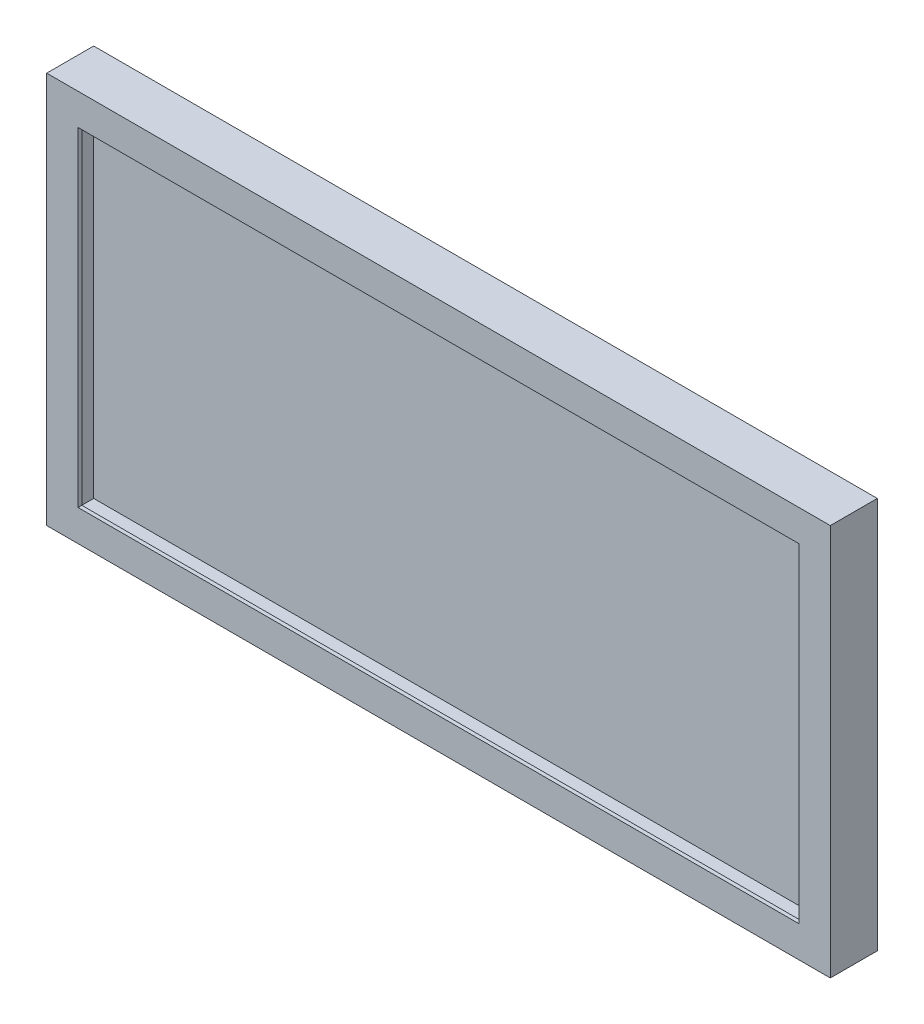
ISO-10303-21;
HEADER;
FILE_DESCRIPTION(('STEP AP214'),'2;1');
FILE_NAME('part.step','',(''),(''),'','','');
FILE_SCHEMA(('AUTOMOTIVE_DESIGN { 1 0 10303 214 1 1 1 1 }'));
ENDSEC;
DATA;
#1=APPLICATION_CONTEXT('core data for automotive mechanical design processes');
#2=APPLICATION_PROTOCOL_DEFINITION('international standard','automotive_design',2000,#1);
#3=PRODUCT_CONTEXT('',#1,'mechanical');
#4=PRODUCT('Part','Part','',(#3));
#5=PRODUCT_RELATED_PRODUCT_CATEGORY('part','',(#4));
#6=PRODUCT_DEFINITION_FORMATION('','',#4);
#7=PRODUCT_DEFINITION_CONTEXT('part definition',#1,'design');
#8=PRODUCT_DEFINITION('design','',#6,#7);
#9=PRODUCT_DEFINITION_SHAPE('','',#8);
#10=(LENGTH_UNIT() NAMED_UNIT(*) SI_UNIT(.MILLI.,.METRE.));
#11=(NAMED_UNIT(*) PLANE_ANGLE_UNIT() SI_UNIT($,.RADIAN.));
#12=(NAMED_UNIT(*) SI_UNIT($,.STERADIAN.) SOLID_ANGLE_UNIT());
#13=UNCERTAINTY_MEASURE_WITH_UNIT(LENGTH_MEASURE(1.E-05),#10,'distance_accuracy_value','');
#14=(GEOMETRIC_REPRESENTATION_CONTEXT(3) GLOBAL_UNCERTAINTY_ASSIGNED_CONTEXT((#13)) GLOBAL_UNIT_ASSIGNED_CONTEXT((#10,
#11,#12)) REPRESENTATION_CONTEXT('',''));
#15=CARTESIAN_POINT('',(0.,0.,0.));
#16=DIRECTION('',(0.,0.,1.));
#17=DIRECTION('',(1.,0.,0.));
#18=AXIS2_PLACEMENT_3D('',#15,#16,#17);
#19=CARTESIAN_POINT('',(-125.,-61.3,15.));
#20=DIRECTION('',(0.,1.,0.));
#21=DIRECTION('',(-1.,0.,0.));
#22=AXIS2_PLACEMENT_3D('',#19,#20,#21);
#23=PLANE('',#22);
#24=DIRECTION('',(1.,0.,0.));
#25=VECTOR('',#24,1.);
#26=CARTESIAN_POINT('',(-125.,-61.3,1.2));
#27=LINE('',#26,#25);
#28=CARTESIAN_POINT('',(-123.8,-61.3,1.2));
#29=VERTEX_POINT('',#28);
#30=CARTESIAN_POINT('',(123.8,-61.3,1.2));
#31=VERTEX_POINT('',#30);
#32=EDGE_CURVE('E38',#29,#31,#27,.T.);
#33=ORIENTED_EDGE('',*,*,#32,.F.);
#34=DIRECTION('',(0.,0.,-1.));
#35=VECTOR('',#34,1.);
#36=CARTESIAN_POINT('',(-123.8,-61.3,15.));
#37=LINE('',#36,#35);
#38=CARTESIAN_POINT('',(-123.8,-61.3,13.8));
#39=VERTEX_POINT('',#38);
#40=EDGE_CURVE('E202',#39,#29,#37,.T.);
#41=ORIENTED_EDGE('',*,*,#40,.F.);
#42=DIRECTION('',(1.,0.,0.));
#43=VECTOR('',#42,1.);
#44=CARTESIAN_POINT('',(-125.,-61.3,13.8));
#45=LINE('',#44,#43);
#46=CARTESIAN_POINT('',(123.8,-61.3,13.8));
#47=VERTEX_POINT('',#46);
#48=EDGE_CURVE('E185',#39,#47,#45,.T.);
#49=ORIENTED_EDGE('',*,*,#48,.T.);
#50=DIRECTION('',(0.,0.,-1.));
#51=VECTOR('',#50,1.);
#52=CARTESIAN_POINT('',(123.8,-61.3,15.));
#53=LINE('',#52,#51);
#54=EDGE_CURVE('E198',#47,#31,#53,.T.);
#55=ORIENTED_EDGE('',*,*,#54,.T.);
#56=EDGE_LOOP('',(#33,#41,#49,#55));
#57=FACE_BOUND('',#56,.T.);
#58=ADVANCED_FACE('F34',(#57),#23,.T.);
#59=CARTESIAN_POINT('',(123.8,-62.5,15.));
#60=DIRECTION('',(-1.,0.,0.));
#61=DIRECTION('',(0.,0.,1.));
#62=AXIS2_PLACEMENT_3D('',#59,#60,#61);
#63=PLANE('',#62);
#64=DIRECTION('',(0.,1.,0.));
#65=VECTOR('',#64,1.);
#66=CARTESIAN_POINT('',(123.8,-62.5,1.2));
#67=LINE('',#66,#65);
#68=CARTESIAN_POINT('',(123.8,61.3,1.2));
#69=VERTEX_POINT('',#68);
#70=EDGE_CURVE('E201',#31,#69,#67,.T.);
#71=ORIENTED_EDGE('',*,*,#70,.F.);
#72=ORIENTED_EDGE('',*,*,#54,.F.);
#73=DIRECTION('',(0.,1.,0.));
#74=VECTOR('',#73,1.);
#75=CARTESIAN_POINT('',(123.8,-62.5,13.8));
#76=LINE('',#75,#74);
#77=CARTESIAN_POINT('',(123.8,61.3,13.8));
#78=VERTEX_POINT('',#77);
#79=EDGE_CURVE('E183',#47,#78,#76,.T.);
#80=ORIENTED_EDGE('',*,*,#79,.T.);
#81=DIRECTION('',(0.,0.,-1.));
#82=VECTOR('',#81,1.);
#83=CARTESIAN_POINT('',(123.8,61.3,15.));
#84=LINE('',#83,#82);
#85=EDGE_CURVE('E193',#78,#69,#84,.T.);
#86=ORIENTED_EDGE('',*,*,#85,.T.);
#87=EDGE_LOOP('',(#71,#72,#80,#86));
#88=FACE_BOUND('',#87,.T.);
#89=ADVANCED_FACE('F214',(#88),#63,.T.);
#90=CARTESIAN_POINT('',(-125.,61.3,15.));
#91=DIRECTION('',(0.,-1.,0.));
#92=DIRECTION('',(0.,0.,-1.));
#93=AXIS2_PLACEMENT_3D('',#90,#91,#92);
#94=PLANE('',#93);
#95=DIRECTION('',(-1.,0.,0.));
#96=VECTOR('',#95,1.);
#97=CARTESIAN_POINT('',(-125.,61.3,1.2));
#98=LINE('',#97,#96);
#99=CARTESIAN_POINT('',(-123.8,61.3,1.2));
#100=VERTEX_POINT('',#99);
#101=EDGE_CURVE('E196',#69,#100,#98,.T.);
#102=ORIENTED_EDGE('',*,*,#101,.F.);
#103=ORIENTED_EDGE('',*,*,#85,.F.);
#104=DIRECTION('',(-1.,0.,0.));
#105=VECTOR('',#104,1.);
#106=CARTESIAN_POINT('',(-125.,61.3,13.8));
#107=LINE('',#106,#105);
#108=CARTESIAN_POINT('',(-123.8,61.3,13.8));
#109=VERTEX_POINT('',#108);
#110=EDGE_CURVE('E43',#78,#109,#107,.T.);
#111=ORIENTED_EDGE('',*,*,#110,.T.);
#112=DIRECTION('',(0.,0.,-1.));
#113=VECTOR('',#112,1.);
#114=CARTESIAN_POINT('',(-123.8,61.3,15.));
#115=LINE('',#114,#113);
#116=EDGE_CURVE('E188',#109,#100,#115,.T.);
#117=ORIENTED_EDGE('',*,*,#116,.T.);
#118=EDGE_LOOP('',(#102,#103,#111,#117));
#119=FACE_BOUND('',#118,.T.);
#120=ADVANCED_FACE('F219',(#119),#94,.T.);
#121=CARTESIAN_POINT('',(-123.8,-62.5,15.));
#122=DIRECTION('',(1.,0.,0.));
#123=DIRECTION('',(0.,0.,-1.));
#124=AXIS2_PLACEMENT_3D('',#121,#122,#123);
#125=PLANE('',#124);
#126=DIRECTION('',(0.,-1.,0.));
#127=VECTOR('',#126,1.);
#128=CARTESIAN_POINT('',(-123.8,-62.5,1.2));
#129=LINE('',#128,#127);
#130=EDGE_CURVE('E191',#100,#29,#129,.T.);
#131=ORIENTED_EDGE('',*,*,#130,.F.);
#132=ORIENTED_EDGE('',*,*,#116,.F.);
#133=DIRECTION('',(0.,-1.,0.));
#134=VECTOR('',#133,1.);
#135=CARTESIAN_POINT('',(-123.8,-62.5,13.8));
#136=LINE('',#135,#134);
#137=EDGE_CURVE('E11',#109,#39,#136,.T.);
#138=ORIENTED_EDGE('',*,*,#137,.T.);
#139=ORIENTED_EDGE('',*,*,#40,.T.);
#140=EDGE_LOOP('',(#131,#132,#138,#139));
#141=FACE_BOUND('',#140,.T.);
#142=ADVANCED_FACE('F222',(#141),#125,.T.);
#143=CARTESIAN_POINT('',(0.,0.,13.8));
#144=DIRECTION('',(0.,0.,1.));
#145=DIRECTION('',(1.,0.,0.));
#146=AXIS2_PLACEMENT_3D('',#143,#144,#145);
#147=PLANE('',#146);
#148=DIRECTION('',(0.,1.,0.));
#149=VECTOR('',#148,1.);
#150=CARTESIAN_POINT('',(-115.,52.5,13.8));
#151=LINE('',#150,#149);
#152=CARTESIAN_POINT('',(-115.,-52.5,13.8));
#153=VERTEX_POINT('',#152);
#154=CARTESIAN_POINT('',(-115.,52.5,13.8));
#155=VERTEX_POINT('',#154);
#156=EDGE_CURVE('E128',#153,#155,#151,.T.);
#157=ORIENTED_EDGE('',*,*,#156,.F.);
#158=DIRECTION('',(-1.,0.,0.));
#159=VECTOR('',#158,1.);
#160=CARTESIAN_POINT('',(-115.,-52.5,13.8));
#161=LINE('',#160,#159);
#162=CARTESIAN_POINT('',(115.,-52.5,13.8));
#163=VERTEX_POINT('',#162);
#164=EDGE_CURVE('E135',#163,#153,#161,.T.);
#165=ORIENTED_EDGE('',*,*,#164,.F.);
#166=DIRECTION('',(0.,-1.,0.));
#167=VECTOR('',#166,1.);
#168=CARTESIAN_POINT('',(115.,-52.5,13.8));
#169=LINE('',#168,#167);
#170=CARTESIAN_POINT('',(115.,52.5,13.8));
#171=VERTEX_POINT('',#170);
#172=EDGE_CURVE('E140',#171,#163,#169,.T.);
#173=ORIENTED_EDGE('',*,*,#172,.F.);
#174=DIRECTION('',(1.,0.,0.));
#175=VECTOR('',#174,1.);
#176=CARTESIAN_POINT('',(115.,52.5,13.8));
#177=LINE('',#176,#175);
#178=EDGE_CURVE('E59',#155,#171,#177,.T.);
#179=ORIENTED_EDGE('',*,*,#178,.F.);
#180=EDGE_LOOP('',(#157,#165,#173,#179));
#181=FACE_BOUND('',#180,.T.);
#182=ORIENTED_EDGE('',*,*,#48,.F.);
#183=ORIENTED_EDGE('',*,*,#137,.F.);
#184=ORIENTED_EDGE('',*,*,#110,.F.);
#185=ORIENTED_EDGE('',*,*,#79,.F.);
#186=EDGE_LOOP('',(#182,#183,#184,#185));
#187=FACE_BOUND('',#186,.T.);
#188=ADVANCED_FACE('F142',(#181,#187),#147,.F.);
#189=CARTESIAN_POINT('',(0.,0.,1.2));
#190=DIRECTION('',(0.,0.,1.));
#191=DIRECTION('',(1.,0.,0.));
#192=AXIS2_PLACEMENT_3D('',#189,#190,#191);
#193=PLANE('',#192);
#194=ORIENTED_EDGE('',*,*,#32,.T.);
#195=ORIENTED_EDGE('',*,*,#70,.T.);
#196=ORIENTED_EDGE('',*,*,#101,.T.);
#197=ORIENTED_EDGE('',*,*,#130,.T.);
#198=EDGE_LOOP('',(#194,#195,#196,#197));
#199=FACE_BOUND('',#198,.T.);
#200=ADVANCED_FACE('F36',(#199),#193,.T.);
#201=CARTESIAN_POINT('',(-115.,-52.5,-0.000999999999999265));
#202=DIRECTION('',(0.,-1.,0.));
#203=DIRECTION('',(1.,0.,0.));
#204=AXIS2_PLACEMENT_3D('',#201,#202,#203);
#205=PLANE('',#204);
#206=ORIENTED_EDGE('',*,*,#164,.T.);
#207=DIRECTION('',(0.,0.,1.));
#208=VECTOR('',#207,1.);
#209=CARTESIAN_POINT('',(-115.,-52.5,-0.000999999999999265));
#210=LINE('',#209,#208);
#211=CARTESIAN_POINT('',(-115.,-52.5,15.));
#212=VERTEX_POINT('',#211);
#213=EDGE_CURVE('E124',#153,#212,#210,.T.);
#214=ORIENTED_EDGE('',*,*,#213,.T.);
#215=DIRECTION('',(1.,0.,0.));
#216=VECTOR('',#215,1.);
#217=CARTESIAN_POINT('',(-115.,-52.5,15.));
#218=LINE('',#217,#216);
#219=CARTESIAN_POINT('',(115.,-52.5,15.));
#220=VERTEX_POINT('',#219);
#221=EDGE_CURVE('E51',#212,#220,#218,.T.);
#222=ORIENTED_EDGE('',*,*,#221,.T.);
#223=DIRECTION('',(0.,0.,1.));
#224=VECTOR('',#223,1.);
#225=CARTESIAN_POINT('',(115.,-52.5,-0.000999999999999265));
#226=LINE('',#225,#224);
#227=EDGE_CURVE('E132',#163,#220,#226,.T.);
#228=ORIENTED_EDGE('',*,*,#227,.F.);
#229=EDGE_LOOP('',(#206,#214,#222,#228));
#230=FACE_BOUND('',#229,.T.);
#231=ADVANCED_FACE('F136',(#230),#205,.F.);
#232=CARTESIAN_POINT('',(-115.,52.5,-0.000999999999999265));
#233=DIRECTION('',(-1.,0.,0.));
#234=DIRECTION('',(0.,0.,1.));
#235=AXIS2_PLACEMENT_3D('',#232,#233,#234);
#236=PLANE('',#235);
#237=ORIENTED_EDGE('',*,*,#156,.T.);
#238=DIRECTION('',(0.,0.,1.));
#239=VECTOR('',#238,1.);
#240=CARTESIAN_POINT('',(-115.,52.5,-0.000999999999999265));
#241=LINE('',#240,#239);
#242=CARTESIAN_POINT('',(-115.,52.5,15.));
#243=VERTEX_POINT('',#242);
#244=EDGE_CURVE('E131',#155,#243,#241,.T.);
#245=ORIENTED_EDGE('',*,*,#244,.T.);
#246=DIRECTION('',(0.,-1.,0.));
#247=VECTOR('',#246,1.);
#248=CARTESIAN_POINT('',(-115.,52.5,15.));
#249=LINE('',#248,#247);
#250=EDGE_CURVE('E130',#243,#212,#249,.T.);
#251=ORIENTED_EDGE('',*,*,#250,.T.);
#252=ORIENTED_EDGE('',*,*,#213,.F.);
#253=EDGE_LOOP('',(#237,#245,#251,#252));
#254=FACE_BOUND('',#253,.T.);
#255=ADVANCED_FACE('F126',(#254),#236,.F.);
#256=CARTESIAN_POINT('',(115.,52.5,-0.000999999999999265));
#257=DIRECTION('',(0.,1.,0.));
#258=DIRECTION('',(0.,0.,1.));
#259=AXIS2_PLACEMENT_3D('',#256,#257,#258);
#260=PLANE('',#259);
#261=ORIENTED_EDGE('',*,*,#178,.T.);
#262=DIRECTION('',(0.,0.,1.));
#263=VECTOR('',#262,1.);
#264=CARTESIAN_POINT('',(115.,52.5,-0.000999999999999265));
#265=LINE('',#264,#263);
#266=CARTESIAN_POINT('',(115.,52.5,15.));
#267=VERTEX_POINT('',#266);
#268=EDGE_CURVE('E149',#171,#267,#265,.T.);
#269=ORIENTED_EDGE('',*,*,#268,.T.);
#270=DIRECTION('',(-1.,0.,0.));
#271=VECTOR('',#270,1.);
#272=CARTESIAN_POINT('',(115.,52.5,15.));
#273=LINE('',#272,#271);
#274=EDGE_CURVE('E279',#267,#243,#273,.T.);
#275=ORIENTED_EDGE('',*,*,#274,.T.);
#276=ORIENTED_EDGE('',*,*,#244,.F.);
#277=EDGE_LOOP('',(#261,#269,#275,#276));
#278=FACE_BOUND('',#277,.T.);
#279=ADVANCED_FACE('F267',(#278),#260,.F.);
#280=CARTESIAN_POINT('',(115.,-52.5,-0.000999999999999265));
#281=DIRECTION('',(1.,0.,0.));
#282=DIRECTION('',(0.,0.,-1.));
#283=AXIS2_PLACEMENT_3D('',#280,#281,#282);
#284=PLANE('',#283);
#285=ORIENTED_EDGE('',*,*,#172,.T.);
#286=ORIENTED_EDGE('',*,*,#227,.T.);
#287=DIRECTION('',(0.,1.,0.));
#288=VECTOR('',#287,1.);
#289=CARTESIAN_POINT('',(115.,-52.5,15.));
#290=LINE('',#289,#288);
#291=EDGE_CURVE('E282',#220,#267,#290,.T.);
#292=ORIENTED_EDGE('',*,*,#291,.T.);
#293=ORIENTED_EDGE('',*,*,#268,.F.);
#294=EDGE_LOOP('',(#285,#286,#292,#293));
#295=FACE_BOUND('',#294,.T.);
#296=ADVANCED_FACE('F243',(#295),#284,.F.);
#297=CARTESIAN_POINT('',(-125.,-62.5,15.));
#298=DIRECTION('',(0.,1.,0.));
#299=DIRECTION('',(-1.,0.,0.));
#300=AXIS2_PLACEMENT_3D('',#297,#298,#299);
#301=PLANE('',#300);
#302=DIRECTION('',(1.,0.,0.));
#303=VECTOR('',#302,1.);
#304=CARTESIAN_POINT('',(-125.,-62.5,0.));
#305=LINE('',#304,#303);
#306=CARTESIAN_POINT('',(-125.,-62.5,0.));
#307=VERTEX_POINT('',#306);
#308=CARTESIAN_POINT('',(125.,-62.5,0.));
#309=VERTEX_POINT('',#308);
#310=EDGE_CURVE('E163',#307,#309,#305,.T.);
#311=ORIENTED_EDGE('',*,*,#310,.T.);
#312=DIRECTION('',(0.,0.,-1.));
#313=VECTOR('',#312,1.);
#314=CARTESIAN_POINT('',(125.,-62.5,15.));
#315=LINE('',#314,#313);
#316=CARTESIAN_POINT('',(125.,-62.5,15.));
#317=VERTEX_POINT('',#316);
#318=EDGE_CURVE('E179',#317,#309,#315,.T.);
#319=ORIENTED_EDGE('',*,*,#318,.F.);
#320=DIRECTION('',(1.,0.,0.));
#321=VECTOR('',#320,1.);
#322=CARTESIAN_POINT('',(-125.,-62.5,15.));
#323=LINE('',#322,#321);
#324=CARTESIAN_POINT('',(-125.,-62.5,15.));
#325=VERTEX_POINT('',#324);
#326=EDGE_CURVE('E152',#325,#317,#323,.T.);
#327=ORIENTED_EDGE('',*,*,#326,.F.);
#328=DIRECTION('',(0.,0.,-1.));
#329=VECTOR('',#328,1.);
#330=CARTESIAN_POINT('',(-125.,-62.5,15.));
#331=LINE('',#330,#329);
#332=EDGE_CURVE('E162',#325,#307,#331,.T.);
#333=ORIENTED_EDGE('',*,*,#332,.T.);
#334=EDGE_LOOP('',(#311,#319,#327,#333));
#335=FACE_BOUND('',#334,.T.);
#336=ADVANCED_FACE('F239',(#335),#301,.F.);
#337=CARTESIAN_POINT('',(125.,-62.5,15.));
#338=DIRECTION('',(-1.,0.,0.));
#339=DIRECTION('',(0.,0.,1.));
#340=AXIS2_PLACEMENT_3D('',#337,#338,#339);
#341=PLANE('',#340);
#342=DIRECTION('',(0.,1.,0.));
#343=VECTOR('',#342,1.);
#344=CARTESIAN_POINT('',(125.,-62.5,0.));
#345=LINE('',#344,#343);
#346=CARTESIAN_POINT('',(125.,62.5,0.));
#347=VERTEX_POINT('',#346);
#348=EDGE_CURVE('E166',#309,#347,#345,.T.);
#349=ORIENTED_EDGE('',*,*,#348,.T.);
#350=DIRECTION('',(0.,0.,-1.));
#351=VECTOR('',#350,1.);
#352=CARTESIAN_POINT('',(125.,62.5,15.));
#353=LINE('',#352,#351);
#354=CARTESIAN_POINT('',(125.,62.5,15.));
#355=VERTEX_POINT('',#354);
#356=EDGE_CURVE('E176',#355,#347,#353,.T.);
#357=ORIENTED_EDGE('',*,*,#356,.F.);
#358=DIRECTION('',(0.,1.,0.));
#359=VECTOR('',#358,1.);
#360=CARTESIAN_POINT('',(125.,-62.5,15.));
#361=LINE('',#360,#359);
#362=EDGE_CURVE('E155',#317,#355,#361,.T.);
#363=ORIENTED_EDGE('',*,*,#362,.F.);
#364=ORIENTED_EDGE('',*,*,#318,.T.);
#365=EDGE_LOOP('',(#349,#357,#363,#364));
#366=FACE_BOUND('',#365,.T.);
#367=ADVANCED_FACE('F242',(#366),#341,.F.);
#368=CARTESIAN_POINT('',(-125.,62.5,15.));
#369=DIRECTION('',(0.,-1.,0.));
#370=DIRECTION('',(0.,0.,-1.));
#371=AXIS2_PLACEMENT_3D('',#368,#369,#370);
#372=PLANE('',#371);
#373=DIRECTION('',(-1.,0.,0.));
#374=VECTOR('',#373,1.);
#375=CARTESIAN_POINT('',(-125.,62.5,0.));
#376=LINE('',#375,#374);
#377=CARTESIAN_POINT('',(-125.,62.5,0.));
#378=VERTEX_POINT('',#377);
#379=EDGE_CURVE('E168',#347,#378,#376,.T.);
#380=ORIENTED_EDGE('',*,*,#379,.T.);
#381=DIRECTION('',(0.,0.,-1.));
#382=VECTOR('',#381,1.);
#383=CARTESIAN_POINT('',(-125.,62.5,15.));
#384=LINE('',#383,#382);
#385=CARTESIAN_POINT('',(-125.,62.5,15.));
#386=VERTEX_POINT('',#385);
#387=EDGE_CURVE('E173',#386,#378,#384,.T.);
#388=ORIENTED_EDGE('',*,*,#387,.F.);
#389=DIRECTION('',(-1.,0.,0.));
#390=VECTOR('',#389,1.);
#391=CARTESIAN_POINT('',(-125.,62.5,15.));
#392=LINE('',#391,#390);
#393=EDGE_CURVE('E158',#355,#386,#392,.T.);
#394=ORIENTED_EDGE('',*,*,#393,.F.);
#395=ORIENTED_EDGE('',*,*,#356,.T.);
#396=EDGE_LOOP('',(#380,#388,#394,#395));
#397=FACE_BOUND('',#396,.T.);
#398=ADVANCED_FACE('F247',(#397),#372,.F.);
#399=CARTESIAN_POINT('',(-125.,-62.5,15.));
#400=DIRECTION('',(1.,0.,0.));
#401=DIRECTION('',(0.,0.,-1.));
#402=AXIS2_PLACEMENT_3D('',#399,#400,#401);
#403=PLANE('',#402);
#404=DIRECTION('',(0.,-1.,0.));
#405=VECTOR('',#404,1.);
#406=CARTESIAN_POINT('',(-125.,-62.5,0.));
#407=LINE('',#406,#405);
#408=EDGE_CURVE('E156',#378,#307,#407,.T.);
#409=ORIENTED_EDGE('',*,*,#408,.T.);
#410=ORIENTED_EDGE('',*,*,#332,.F.);
#411=DIRECTION('',(0.,-1.,0.));
#412=VECTOR('',#411,1.);
#413=CARTESIAN_POINT('',(-125.,-62.5,15.));
#414=LINE('',#413,#412);
#415=EDGE_CURVE('E160',#386,#325,#414,.T.);
#416=ORIENTED_EDGE('',*,*,#415,.F.);
#417=ORIENTED_EDGE('',*,*,#387,.T.);
#418=EDGE_LOOP('',(#409,#410,#416,#417));
#419=FACE_BOUND('',#418,.T.);
#420=ADVANCED_FACE('F251',(#419),#403,.F.);
#421=CARTESIAN_POINT('',(0.,0.,15.));
#422=DIRECTION('',(0.,0.,1.));
#423=DIRECTION('',(1.,0.,0.));
#424=AXIS2_PLACEMENT_3D('',#421,#422,#423);
#425=PLANE('',#424);
#426=ORIENTED_EDGE('',*,*,#221,.F.);
#427=ORIENTED_EDGE('',*,*,#250,.F.);
#428=ORIENTED_EDGE('',*,*,#274,.F.);
#429=ORIENTED_EDGE('',*,*,#291,.F.);
#430=EDGE_LOOP('',(#426,#427,#428,#429));
#431=FACE_BOUND('',#430,.T.);
#432=ORIENTED_EDGE('',*,*,#326,.T.);
#433=ORIENTED_EDGE('',*,*,#362,.T.);
#434=ORIENTED_EDGE('',*,*,#393,.T.);
#435=ORIENTED_EDGE('',*,*,#415,.T.);
#436=EDGE_LOOP('',(#432,#433,#434,#435));
#437=FACE_BOUND('',#436,.T.);
#438=ADVANCED_FACE('F255',(#431,#437),#425,.T.);
#439=CARTESIAN_POINT('',(0.,0.,0.));
#440=DIRECTION('',(0.,0.,1.));
#441=DIRECTION('',(1.,0.,0.));
#442=AXIS2_PLACEMENT_3D('',#439,#440,#441);
#443=PLANE('',#442);
#444=ORIENTED_EDGE('',*,*,#310,.F.);
#445=ORIENTED_EDGE('',*,*,#408,.F.);
#446=ORIENTED_EDGE('',*,*,#379,.F.);
#447=ORIENTED_EDGE('',*,*,#348,.F.);
#448=EDGE_LOOP('',(#444,#445,#446,#447));
#449=FACE_BOUND('',#448,.T.);
#450=ADVANCED_FACE('F257',(#449),#443,.F.);
#451=CLOSED_SHELL('',(#58,#89,#120,#142,#188,#200,#231,#255,#279,#296,#336,#367,#398,#420,#438,#450));
#452=MANIFOLD_SOLID_BREP('B2',#451);
#453=ADVANCED_BREP_SHAPE_REPRESENTATION('',(#18,#452),#14);
#454=SHAPE_DEFINITION_REPRESENTATION(#9,#453);
ENDSEC;
END-ISO-10303-21;
